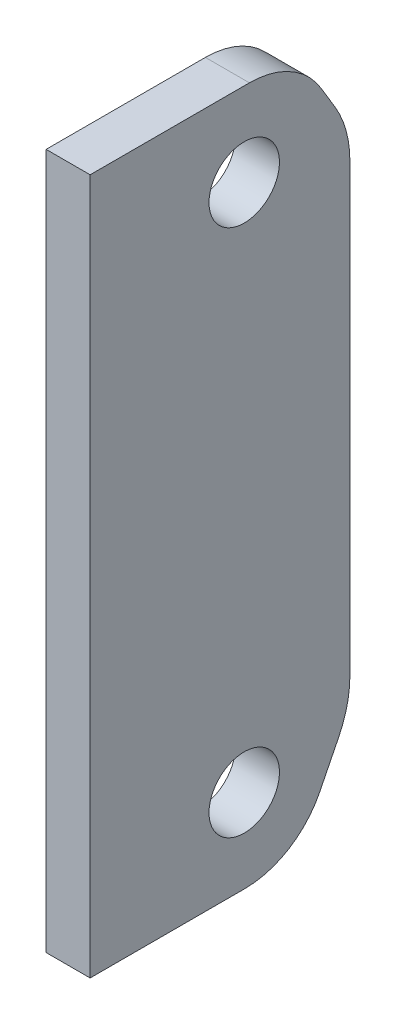
ISO-10303-21;
HEADER;
FILE_DESCRIPTION(('STEP AP214'),'2;1');
FILE_NAME('part.step','',(''),(''),'','','');
FILE_SCHEMA(('AUTOMOTIVE_DESIGN { 1 0 10303 214 1 1 1 1 }'));
ENDSEC;
DATA;
#1=APPLICATION_CONTEXT('core data for automotive mechanical design processes');
#2=APPLICATION_PROTOCOL_DEFINITION('international standard','automotive_design',2000,#1);
#3=PRODUCT_CONTEXT('',#1,'mechanical');
#4=PRODUCT('Part','Part','',(#3));
#5=PRODUCT_RELATED_PRODUCT_CATEGORY('part','',(#4));
#6=PRODUCT_DEFINITION_FORMATION('','',#4);
#7=PRODUCT_DEFINITION_CONTEXT('part definition',#1,'design');
#8=PRODUCT_DEFINITION('design','',#6,#7);
#9=PRODUCT_DEFINITION_SHAPE('','',#8);
#10=(LENGTH_UNIT() NAMED_UNIT(*) SI_UNIT(.MILLI.,.METRE.));
#11=(NAMED_UNIT(*) PLANE_ANGLE_UNIT() SI_UNIT($,.RADIAN.));
#12=(NAMED_UNIT(*) SI_UNIT($,.STERADIAN.) SOLID_ANGLE_UNIT());
#13=UNCERTAINTY_MEASURE_WITH_UNIT(LENGTH_MEASURE(1.E-05),#10,'distance_accuracy_value','');
#14=(GEOMETRIC_REPRESENTATION_CONTEXT(3) GLOBAL_UNCERTAINTY_ASSIGNED_CONTEXT((#13)) GLOBAL_UNIT_ASSIGNED_CONTEXT((#10,
#11,#12)) REPRESENTATION_CONTEXT('',''));
#15=CARTESIAN_POINT('',(0.,0.,0.));
#16=DIRECTION('',(0.,0.,1.));
#17=DIRECTION('',(1.,0.,0.));
#18=AXIS2_PLACEMENT_3D('',#15,#16,#17);
#19=CARTESIAN_POINT('',(49.6499575162025,86.6658834091797,-71.2636761981221));
#20=DIRECTION('',(-1.,0.,0.));
#21=DIRECTION('',(0.,0.,-1.));
#22=AXIS2_PLACEMENT_3D('',#19,#20,#21);
#23=CYLINDRICAL_SURFACE('',#22,1.59999999999998);
#24=CARTESIAN_POINT('',(13.4739425349323,86.6658834091797,-71.2636761981221));
#25=DIRECTION('',(-1.,0.,0.));
#26=DIRECTION('',(0.,0.,1.));
#27=AXIS2_PLACEMENT_3D('',#24,#25,#26);
#28=CIRCLE('',#27,1.59999999999998);
#29=CARTESIAN_POINT('',(13.4739425349323,86.6658834091797,-69.6636761981221));
#30=VERTEX_POINT('',#29);
#31=EDGE_CURVE('E170',#30,#30,#28,.T.);
#32=ORIENTED_EDGE('',*,*,#31,.T.);
#33=EDGE_LOOP('',(#32));
#34=FACE_BOUND('',#33,.T.);
#35=CARTESIAN_POINT('',(15.4739425349322,86.6658834091797,-71.2636761981221));
#36=DIRECTION('',(-1.,0.,0.));
#37=DIRECTION('',(0.,0.,1.));
#38=AXIS2_PLACEMENT_3D('',#35,#36,#37);
#39=CIRCLE('',#38,1.59999999999998);
#40=CARTESIAN_POINT('',(15.4739425349322,86.6658834091797,-69.6636761981221));
#41=VERTEX_POINT('',#40);
#42=EDGE_CURVE('E155',#41,#41,#39,.T.);
#43=ORIENTED_EDGE('',*,*,#42,.F.);
#44=EDGE_LOOP('',(#43));
#45=FACE_BOUND('',#44,.T.);
#46=ADVANCED_FACE('F41',(#34,#45),#23,.F.);
#47=CARTESIAN_POINT('',(49.6499575162025,60.96647174628,-74.6903635689223));
#48=DIRECTION('',(0.,0.447213595501017,0.894427190999386));
#49=DIRECTION('',(0.,0.894427190999386,-0.447213595501017));
#50=AXIS2_PLACEMENT_3D('',#47,#48,#49);
#51=PLANE('',#50);
#52=DIRECTION('',(0.,-0.894427190999386,0.447213595501017));
#53=VECTOR('',#52,1.);
#54=CARTESIAN_POINT('',(15.4739425349322,60.96647174628,-74.6903635689223));
#55=LINE('',#54,#53);
#56=CARTESIAN_POINT('',(15.4739425349322,62.6995980382685,-75.5569267149191));
#57=VERTEX_POINT('',#56);
#58=CARTESIAN_POINT('',(15.4739425349322,60.96647174628,-74.6903635689223));
#59=VERTEX_POINT('',#58);
#60=EDGE_CURVE('E151',#57,#59,#55,.T.);
#61=ORIENTED_EDGE('',*,*,#60,.T.);
#62=DIRECTION('',(-1.,0.,0.));
#63=VECTOR('',#62,1.);
#64=CARTESIAN_POINT('',(49.6499575162025,60.9664717462798,-74.6903635689222));
#65=LINE('',#64,#63);
#66=CARTESIAN_POINT('',(13.4739425349323,60.96647174628,-74.6903635689223));
#67=VERTEX_POINT('',#66);
#68=EDGE_CURVE('E137',#59,#67,#65,.T.);
#69=ORIENTED_EDGE('',*,*,#68,.T.);
#70=DIRECTION('',(0.,-0.894427190999386,0.447213595501017));
#71=VECTOR('',#70,1.);
#72=CARTESIAN_POINT('',(13.4739425349323,60.96647174628,-74.6903635689223));
#73=LINE('',#72,#71);
#74=CARTESIAN_POINT('',(13.4739425349323,62.6995980382685,-75.5569267149191));
#75=VERTEX_POINT('',#74);
#76=EDGE_CURVE('E142',#75,#67,#73,.T.);
#77=ORIENTED_EDGE('',*,*,#76,.F.);
#78=DIRECTION('',(1.,0.,0.));
#79=VECTOR('',#78,1.);
#80=CARTESIAN_POINT('',(49.6499575162025,62.6995980382685,-75.5569267149191));
#81=LINE('',#80,#79);
#82=EDGE_CURVE('E181',#57,#75,#81,.F.);
#83=ORIENTED_EDGE('',*,*,#82,.F.);
#84=EDGE_LOOP('',(#61,#69,#77,#83));
#85=FACE_BOUND('',#84,.T.);
#86=ADVANCED_FACE('F226',(#85),#51,.F.);
#87=CARTESIAN_POINT('',(49.6499575162025,86.499216742513,-76.0636761981221));
#88=DIRECTION('',(0.,0.,1.));
#89=DIRECTION('',(-1.,0.,0.));
#90=AXIS2_PLACEMENT_3D('',#87,#88,#89);
#91=PLANE('',#90);
#92=DIRECTION('',(0.,-1.,0.));
#93=VECTOR('',#92,1.);
#94=CARTESIAN_POINT('',(13.4739425349323,86.499216742513,-76.0636761981221));
#95=LINE('',#94,#93);
#96=CARTESIAN_POINT('',(13.4739425349323,85.1142969177709,-76.0636761981221));
#97=VERTEX_POINT('',#96);
#98=CARTESIAN_POINT('',(13.4739425349323,64.8462232966734,-76.0636761981221));
#99=VERTEX_POINT('',#98);
#100=EDGE_CURVE('E173',#97,#99,#95,.T.);
#101=ORIENTED_EDGE('',*,*,#100,.F.);
#102=DIRECTION('',(-1.,0.,0.));
#103=VECTOR('',#102,1.);
#104=CARTESIAN_POINT('',(49.6499575162025,85.1142969177709,-76.0636761981221));
#105=LINE('',#104,#103);
#106=CARTESIAN_POINT('',(15.4739425349322,85.1142969177709,-76.0636761981221));
#107=VERTEX_POINT('',#106);
#108=EDGE_CURVE('E176',#107,#97,#105,.T.);
#109=ORIENTED_EDGE('',*,*,#108,.F.);
#110=DIRECTION('',(0.,-1.,0.));
#111=VECTOR('',#110,1.);
#112=CARTESIAN_POINT('',(15.4739425349322,86.499216742513,-76.0636761981221));
#113=LINE('',#112,#111);
#114=CARTESIAN_POINT('',(15.4739425349322,64.8462232966734,-76.0636761981221));
#115=VERTEX_POINT('',#114);
#116=EDGE_CURVE('E133',#107,#115,#113,.T.);
#117=ORIENTED_EDGE('',*,*,#116,.T.);
#118=DIRECTION('',(-1.,0.,0.));
#119=VECTOR('',#118,1.);
#120=CARTESIAN_POINT('',(49.6499575162025,64.8462232966734,-76.0636761981221));
#121=LINE('',#120,#119);
#122=EDGE_CURVE('E148',#99,#115,#121,.F.);
#123=ORIENTED_EDGE('',*,*,#122,.F.);
#124=EDGE_LOOP('',(#101,#109,#117,#123));
#125=FACE_BOUND('',#124,.T.);
#126=ADVANCED_FACE('F235',(#125),#91,.F.);
#127=CARTESIAN_POINT('',(49.6499575162025,88.6209672798044,-74.7573877999535));
#128=DIRECTION('',(0.,-0.514495755427515,0.857492925712551));
#129=DIRECTION('',(0.,0.857492925712551,0.514495755427515));
#130=AXIS2_PLACEMENT_3D('',#127,#128,#129);
#131=PLANE('',#130);
#132=DIRECTION('',(0.,-0.857492925712551,-0.514495755427515));
#133=VECTOR('',#132,1.);
#134=CARTESIAN_POINT('',(13.4739425349323,88.6209672798044,-74.7573877999535));
#135=LINE('',#134,#133);
#136=CARTESIAN_POINT('',(13.4739425349323,88.6209672798044,-74.7573877999535));
#137=VERTEX_POINT('',#136);
#138=CARTESIAN_POINT('',(13.4739425349323,87.583876543823,-75.3796422415423));
#139=VERTEX_POINT('',#138);
#140=EDGE_CURVE('E136',#137,#139,#135,.T.);
#141=ORIENTED_EDGE('',*,*,#140,.F.);
#142=DIRECTION('',(1.,0.,0.));
#143=VECTOR('',#142,1.);
#144=CARTESIAN_POINT('',(49.6499575162025,88.6209672798044,-74.7573877999535));
#145=LINE('',#144,#143);
#146=CARTESIAN_POINT('',(15.4739425349322,88.6209672798044,-74.7573877999535));
#147=VERTEX_POINT('',#146);
#148=EDGE_CURVE('E123',#147,#137,#145,.F.);
#149=ORIENTED_EDGE('',*,*,#148,.F.);
#150=DIRECTION('',(0.,-0.857492925712551,-0.514495755427515));
#151=VECTOR('',#150,1.);
#152=CARTESIAN_POINT('',(15.4739425349322,88.6209672798044,-74.7573877999535));
#153=LINE('',#152,#151);
#154=CARTESIAN_POINT('',(15.4739425349322,87.583876543823,-75.3796422415423));
#155=VERTEX_POINT('',#154);
#156=EDGE_CURVE('E45',#147,#155,#153,.T.);
#157=ORIENTED_EDGE('',*,*,#156,.T.);
#158=DIRECTION('',(1.,0.,0.));
#159=VECTOR('',#158,1.);
#160=CARTESIAN_POINT('',(49.6499575162025,87.583876543823,-75.3796422415423));
#161=LINE('',#160,#159);
#162=EDGE_CURVE('E11',#139,#155,#161,.T.);
#163=ORIENTED_EDGE('',*,*,#162,.F.);
#164=EDGE_LOOP('',(#141,#149,#157,#163));
#165=FACE_BOUND('',#164,.T.);
#166=ADVANCED_FACE('F134',(#165),#131,.F.);
#167=CARTESIAN_POINT('',(49.6499575162025,86.6658834091797,-71.4989146822458));
#168=DIRECTION('',(-1.,0.,0.));
#169=DIRECTION('',(0.,0.,-1.));
#170=AXIS2_PLACEMENT_3D('',#167,#168,#169);
#171=CYLINDRICAL_SURFACE('',#170,3.80000000000003);
#172=CARTESIAN_POINT('',(15.4739425349322,86.6658834091797,-71.4989146822458));
#173=DIRECTION('',(-1.,0.,0.));
#174=DIRECTION('',(0.,0.,1.));
#175=AXIS2_PLACEMENT_3D('',#172,#173,#174);
#176=CIRCLE('',#175,3.80000000000003);
#177=CARTESIAN_POINT('',(15.4739425349322,90.4658834091797,-71.4989146822458));
#178=VERTEX_POINT('',#177);
#179=EDGE_CURVE('E119',#178,#147,#176,.T.);
#180=ORIENTED_EDGE('',*,*,#179,.T.);
#181=ORIENTED_EDGE('',*,*,#148,.T.);
#182=CARTESIAN_POINT('',(13.4739425349323,86.6658834091797,-71.4989146822458));
#183=DIRECTION('',(-1.,0.,0.));
#184=DIRECTION('',(0.,0.,1.));
#185=AXIS2_PLACEMENT_3D('',#182,#183,#184);
#186=CIRCLE('',#185,3.80000000000003);
#187=CARTESIAN_POINT('',(13.4739425349323,90.4658834091797,-71.4989146822458));
#188=VERTEX_POINT('',#187);
#189=EDGE_CURVE('E183',#188,#137,#186,.T.);
#190=ORIENTED_EDGE('',*,*,#189,.F.);
#191=DIRECTION('',(-1.,0.,0.));
#192=VECTOR('',#191,1.);
#193=CARTESIAN_POINT('',(49.6499575162025,90.4658834091797,-71.4989146822458));
#194=LINE('',#193,#192);
#195=EDGE_CURVE('E126',#178,#188,#194,.T.);
#196=ORIENTED_EDGE('',*,*,#195,.F.);
#197=EDGE_LOOP('',(#180,#181,#190,#196));
#198=FACE_BOUND('',#197,.T.);
#199=ADVANCED_FACE('F120',(#198),#171,.T.);
#200=CARTESIAN_POINT('',(49.6499575162025,90.4658834091797,-64.2636761981221));
#201=DIRECTION('',(0.,-1.,0.));
#202=DIRECTION('',(1.,0.,0.));
#203=AXIS2_PLACEMENT_3D('',#200,#201,#202);
#204=PLANE('',#203);
#205=DIRECTION('',(0.,0.,-1.));
#206=VECTOR('',#205,1.);
#207=CARTESIAN_POINT('',(15.4739425349322,90.4658834091797,-64.2636761981221));
#208=LINE('',#207,#206);
#209=CARTESIAN_POINT('',(15.4739425349322,90.4658834091797,-64.2636761981221));
#210=VERTEX_POINT('',#209);
#211=EDGE_CURVE('E128',#210,#178,#208,.T.);
#212=ORIENTED_EDGE('',*,*,#211,.T.);
#213=ORIENTED_EDGE('',*,*,#195,.T.);
#214=DIRECTION('',(0.,0.,-1.));
#215=VECTOR('',#214,1.);
#216=CARTESIAN_POINT('',(13.4739425349323,90.4658834091797,-64.2636761981221));
#217=LINE('',#216,#215);
#218=CARTESIAN_POINT('',(13.4739425349323,90.4658834091797,-64.2636761981221));
#219=VERTEX_POINT('',#218);
#220=EDGE_CURVE('E185',#219,#188,#217,.T.);
#221=ORIENTED_EDGE('',*,*,#220,.F.);
#222=DIRECTION('',(-1.,0.,0.));
#223=VECTOR('',#222,1.);
#224=CARTESIAN_POINT('',(49.6499575162025,90.4658834091797,-64.2636761981221));
#225=LINE('',#224,#223);
#226=EDGE_CURVE('E139',#210,#219,#225,.T.);
#227=ORIENTED_EDGE('',*,*,#226,.F.);
#228=EDGE_LOOP('',(#212,#213,#221,#227));
#229=FACE_BOUND('',#228,.T.);
#230=ADVANCED_FACE('F43',(#229),#204,.F.);
#231=CARTESIAN_POINT('',(49.6499575162025,58.6658834091796,-64.2636761981221));
#232=DIRECTION('',(0.,0.,-1.));
#233=DIRECTION('',(1.,0.,0.));
#234=AXIS2_PLACEMENT_3D('',#231,#232,#233);
#235=PLANE('',#234);
#236=DIRECTION('',(0.,1.,0.));
#237=VECTOR('',#236,1.);
#238=CARTESIAN_POINT('',(15.4739425349322,58.6658834091796,-64.2636761981221));
#239=LINE('',#238,#237);
#240=CARTESIAN_POINT('',(15.4739425349322,58.8658834091796,-64.2636761981221));
#241=VERTEX_POINT('',#240);
#242=EDGE_CURVE('E161',#241,#210,#239,.T.);
#243=ORIENTED_EDGE('',*,*,#242,.T.);
#244=ORIENTED_EDGE('',*,*,#226,.T.);
#245=DIRECTION('',(0.,1.,0.));
#246=VECTOR('',#245,1.);
#247=CARTESIAN_POINT('',(13.4739425349323,58.6658834091796,-64.2636761981221));
#248=LINE('',#247,#246);
#249=CARTESIAN_POINT('',(13.4739425349323,58.8658834091796,-64.2636761981221));
#250=VERTEX_POINT('',#249);
#251=EDGE_CURVE('E167',#250,#219,#248,.T.);
#252=ORIENTED_EDGE('',*,*,#251,.F.);
#253=DIRECTION('',(-1.,0.,0.));
#254=VECTOR('',#253,1.);
#255=CARTESIAN_POINT('',(49.6499575162025,58.8658834091796,-64.2636761981221));
#256=LINE('',#255,#254);
#257=EDGE_CURVE('E162',#241,#250,#256,.T.);
#258=ORIENTED_EDGE('',*,*,#257,.F.);
#259=EDGE_LOOP('',(#243,#244,#252,#258));
#260=FACE_BOUND('',#259,.T.);
#261=ADVANCED_FACE('F227',(#260),#235,.F.);
#262=CARTESIAN_POINT('',(49.6499575162025,58.8658834091796,-64.2636761981221));
#263=DIRECTION('',(0.,1.,0.));
#264=DIRECTION('',(-1.,0.,0.));
#265=AXIS2_PLACEMENT_3D('',#262,#263,#264);
#266=PLANE('',#265);
#267=DIRECTION('',(0.,0.,1.));
#268=VECTOR('',#267,1.);
#269=CARTESIAN_POINT('',(15.4739425349322,58.8658834091796,-64.2636761981221));
#270=LINE('',#269,#268);
#271=CARTESIAN_POINT('',(15.4739425349322,58.8658834091796,-71.2915402431225));
#272=VERTEX_POINT('',#271);
#273=EDGE_CURVE('E159',#272,#241,#270,.T.);
#274=ORIENTED_EDGE('',*,*,#273,.T.);
#275=ORIENTED_EDGE('',*,*,#257,.T.);
#276=DIRECTION('',(0.,0.,1.));
#277=VECTOR('',#276,1.);
#278=CARTESIAN_POINT('',(13.4739425349323,58.8658834091796,-64.2636761981221));
#279=LINE('',#278,#277);
#280=CARTESIAN_POINT('',(13.4739425349323,58.8658834091796,-71.2915402431225));
#281=VERTEX_POINT('',#280);
#282=EDGE_CURVE('E165',#281,#250,#279,.T.);
#283=ORIENTED_EDGE('',*,*,#282,.F.);
#284=DIRECTION('',(-1.,0.,0.));
#285=VECTOR('',#284,1.);
#286=CARTESIAN_POINT('',(49.6499575162025,58.8658834091796,-71.2915402431225));
#287=LINE('',#286,#285);
#288=EDGE_CURVE('E145',#272,#281,#287,.T.);
#289=ORIENTED_EDGE('',*,*,#288,.F.);
#290=EDGE_LOOP('',(#274,#275,#283,#289));
#291=FACE_BOUND('',#290,.T.);
#292=ADVANCED_FACE('F220',(#291),#266,.F.);
#293=CARTESIAN_POINT('',(49.6499575162025,62.6658834091796,-71.2915402431225));
#294=DIRECTION('',(-1.,0.,0.));
#295=DIRECTION('',(0.,0.,-1.));
#296=AXIS2_PLACEMENT_3D('',#293,#294,#295);
#297=CYLINDRICAL_SURFACE('',#296,3.80000000000001);
#298=CARTESIAN_POINT('',(15.4739425349322,62.6658834091796,-71.2915402431225));
#299=DIRECTION('',(-1.,0.,0.));
#300=DIRECTION('',(0.,0.,1.));
#301=AXIS2_PLACEMENT_3D('',#298,#299,#300);
#302=CIRCLE('',#301,3.80000000000001);
#303=EDGE_CURVE('E156',#59,#272,#302,.T.);
#304=ORIENTED_EDGE('',*,*,#303,.T.);
#305=ORIENTED_EDGE('',*,*,#288,.T.);
#306=CARTESIAN_POINT('',(13.4739425349323,62.6658834091796,-71.2915402431225));
#307=DIRECTION('',(-1.,0.,0.));
#308=DIRECTION('',(0.,0.,1.));
#309=AXIS2_PLACEMENT_3D('',#306,#307,#308);
#310=CIRCLE('',#309,3.80000000000001);
#311=EDGE_CURVE('E168',#67,#281,#310,.T.);
#312=ORIENTED_EDGE('',*,*,#311,.F.);
#313=ORIENTED_EDGE('',*,*,#68,.F.);
#314=EDGE_LOOP('',(#304,#305,#312,#313));
#315=FACE_BOUND('',#314,.T.);
#316=ADVANCED_FACE('F216',(#315),#297,.T.);
#317=CARTESIAN_POINT('',(13.4739425349323,62.6658834091796,-71.2915402431225));
#318=DIRECTION('',(1.,0.,0.));
#319=DIRECTION('',(0.,0.,1.));
#320=AXIS2_PLACEMENT_3D('',#317,#318,#319);
#321=PLANE('',#320);
#322=ORIENTED_EDGE('',*,*,#76,.T.);
#323=ORIENTED_EDGE('',*,*,#311,.T.);
#324=ORIENTED_EDGE('',*,*,#282,.T.);
#325=ORIENTED_EDGE('',*,*,#251,.T.);
#326=ORIENTED_EDGE('',*,*,#220,.T.);
#327=ORIENTED_EDGE('',*,*,#189,.T.);
#328=ORIENTED_EDGE('',*,*,#140,.T.);
#329=CARTESIAN_POINT('',(13.4739425349323,85.1142969177709,-71.2636761981221));
#330=DIRECTION('',(-1.,0.,0.));
#331=DIRECTION('',(0.,0.,1.));
#332=AXIS2_PLACEMENT_3D('',#329,#330,#331);
#333=CIRCLE('',#332,4.8);
#334=EDGE_CURVE('E177',#97,#139,#333,.F.);
#335=ORIENTED_EDGE('',*,*,#334,.F.);
#336=ORIENTED_EDGE('',*,*,#100,.T.);
#337=CARTESIAN_POINT('',(13.4739425349323,64.8462232966734,-71.2636761981221));
#338=DIRECTION('',(-1.,0.,0.));
#339=DIRECTION('',(0.,0.,1.));
#340=AXIS2_PLACEMENT_3D('',#337,#338,#339);
#341=CIRCLE('',#340,4.8);
#342=EDGE_CURVE('E174',#75,#99,#341,.F.);
#343=ORIENTED_EDGE('',*,*,#342,.F.);
#344=EDGE_LOOP('',(#322,#323,#324,#325,#326,#327,#328,#335,#336,#343));
#345=FACE_BOUND('',#344,.T.);
#346=ORIENTED_EDGE('',*,*,#31,.F.);
#347=EDGE_LOOP('',(#346));
#348=FACE_BOUND('',#347,.T.);
#349=CARTESIAN_POINT('',(13.4739425349323,62.6658834091797,-71.2636761981221));
#350=DIRECTION('',(-1.,0.,0.));
#351=DIRECTION('',(0.,0.,1.));
#352=AXIS2_PLACEMENT_3D('',#349,#350,#351);
#353=CIRCLE('',#352,1.6);
#354=CARTESIAN_POINT('',(13.4739425349323,62.6658834091797,-69.6636761981221));
#355=VERTEX_POINT('',#354);
#356=EDGE_CURVE('E158',#355,#355,#353,.T.);
#357=ORIENTED_EDGE('',*,*,#356,.F.);
#358=EDGE_LOOP('',(#357));
#359=FACE_BOUND('',#358,.T.);
#360=ADVANCED_FACE('F223',(#345,#348,#359),#321,.F.);
#361=CARTESIAN_POINT('',(49.6499575162025,62.6658834091797,-71.2636761981221));
#362=DIRECTION('',(-1.,0.,0.));
#363=DIRECTION('',(0.,0.,-1.));
#364=AXIS2_PLACEMENT_3D('',#361,#362,#363);
#365=CYLINDRICAL_SURFACE('',#364,1.6);
#366=ORIENTED_EDGE('',*,*,#356,.T.);
#367=EDGE_LOOP('',(#366));
#368=FACE_BOUND('',#367,.T.);
#369=CARTESIAN_POINT('',(15.4739425349322,62.6658834091797,-71.2636761981221));
#370=DIRECTION('',(-1.,0.,0.));
#371=DIRECTION('',(0.,0.,1.));
#372=AXIS2_PLACEMENT_3D('',#369,#370,#371);
#373=CIRCLE('',#372,1.6);
#374=CARTESIAN_POINT('',(15.4739425349322,62.6658834091797,-69.6636761981221));
#375=VERTEX_POINT('',#374);
#376=EDGE_CURVE('E202',#375,#375,#373,.T.);
#377=ORIENTED_EDGE('',*,*,#376,.F.);
#378=EDGE_LOOP('',(#377));
#379=FACE_BOUND('',#378,.T.);
#380=ADVANCED_FACE('F244',(#368,#379),#365,.F.);
#381=CARTESIAN_POINT('',(15.4739425349323,82.665883409179,-64.7636761981221));
#382=DIRECTION('',(1.,0.,0.));
#383=DIRECTION('',(0.,1.,0.));
#384=AXIS2_PLACEMENT_3D('',#381,#382,#383);
#385=PLANE('',#384);
#386=ORIENTED_EDGE('',*,*,#376,.T.);
#387=EDGE_LOOP('',(#386));
#388=FACE_BOUND('',#387,.T.);
#389=ORIENTED_EDGE('',*,*,#42,.T.);
#390=EDGE_LOOP('',(#389));
#391=FACE_BOUND('',#390,.T.);
#392=ORIENTED_EDGE('',*,*,#116,.F.);
#393=CARTESIAN_POINT('',(15.4739425349322,85.1142969177709,-71.2636761981221));
#394=DIRECTION('',(-1.,0.,0.));
#395=DIRECTION('',(0.,0.,1.));
#396=AXIS2_PLACEMENT_3D('',#393,#394,#395);
#397=CIRCLE('',#396,4.8);
#398=EDGE_CURVE('E58',#155,#107,#397,.T.);
#399=ORIENTED_EDGE('',*,*,#398,.F.);
#400=ORIENTED_EDGE('',*,*,#156,.F.);
#401=ORIENTED_EDGE('',*,*,#179,.F.);
#402=ORIENTED_EDGE('',*,*,#211,.F.);
#403=ORIENTED_EDGE('',*,*,#242,.F.);
#404=ORIENTED_EDGE('',*,*,#273,.F.);
#405=ORIENTED_EDGE('',*,*,#303,.F.);
#406=ORIENTED_EDGE('',*,*,#60,.F.);
#407=CARTESIAN_POINT('',(15.4739425349322,64.8462232966734,-71.2636761981221));
#408=DIRECTION('',(-1.,0.,0.));
#409=DIRECTION('',(0.,0.,1.));
#410=AXIS2_PLACEMENT_3D('',#407,#408,#409);
#411=CIRCLE('',#410,4.8);
#412=EDGE_CURVE('E50',#115,#57,#411,.T.);
#413=ORIENTED_EDGE('',*,*,#412,.F.);
#414=EDGE_LOOP('',(#392,#399,#400,#401,#402,#403,#404,#405,#406,#413));
#415=FACE_BOUND('',#414,.T.);
#416=ADVANCED_FACE('F130',(#388,#391,#415),#385,.T.);
#417=CARTESIAN_POINT('',(49.6499575162025,64.8462232966734,-71.2636761981221));
#418=DIRECTION('',(-1.,0.,0.));
#419=DIRECTION('',(0.,0.,-1.));
#420=AXIS2_PLACEMENT_3D('',#417,#418,#419);
#421=CYLINDRICAL_SURFACE('',#420,4.8);
#422=ORIENTED_EDGE('',*,*,#412,.T.);
#423=ORIENTED_EDGE('',*,*,#82,.T.);
#424=ORIENTED_EDGE('',*,*,#342,.T.);
#425=ORIENTED_EDGE('',*,*,#122,.T.);
#426=EDGE_LOOP('',(#422,#423,#424,#425));
#427=FACE_BOUND('',#426,.T.);
#428=ADVANCED_FACE('F236',(#427),#421,.T.);
#429=CARTESIAN_POINT('',(49.6499575162025,85.1142969177709,-71.2636761981221));
#430=DIRECTION('',(-1.,0.,0.));
#431=DIRECTION('',(0.,0.,-1.));
#432=AXIS2_PLACEMENT_3D('',#429,#430,#431);
#433=CYLINDRICAL_SURFACE('',#432,4.8);
#434=ORIENTED_EDGE('',*,*,#398,.T.);
#435=ORIENTED_EDGE('',*,*,#108,.T.);
#436=ORIENTED_EDGE('',*,*,#334,.T.);
#437=ORIENTED_EDGE('',*,*,#162,.T.);
#438=EDGE_LOOP('',(#434,#435,#436,#437));
#439=FACE_BOUND('',#438,.T.);
#440=ADVANCED_FACE('F232',(#439),#433,.T.);
#441=CLOSED_SHELL('',(#46,#86,#126,#166,#199,#230,#261,#292,#316,#360,#380,#416,#428,#440));
#442=MANIFOLD_SOLID_BREP('B2',#441);
#443=ADVANCED_BREP_SHAPE_REPRESENTATION('',(#18,#442),#14);
#444=SHAPE_DEFINITION_REPRESENTATION(#9,#443);
ENDSEC;
END-ISO-10303-21;
